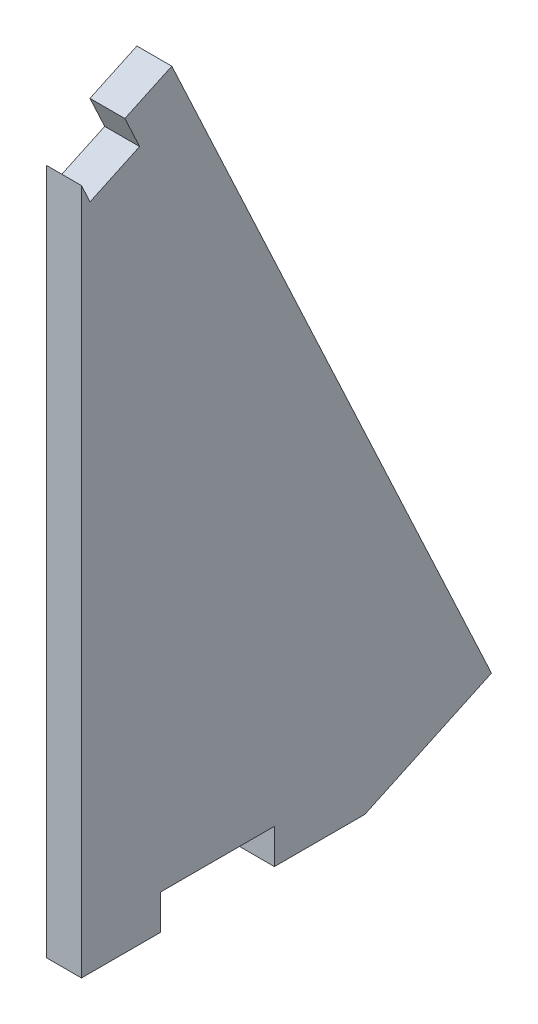
ISO-10303-21;
HEADER;
FILE_DESCRIPTION(('STEP AP214'),'2;1');
FILE_NAME('part.step','',(''),(''),'','','');
FILE_SCHEMA(('AUTOMOTIVE_DESIGN { 1 0 10303 214 1 1 1 1 }'));
ENDSEC;
DATA;
#1=APPLICATION_CONTEXT('core data for automotive mechanical design processes');
#2=APPLICATION_PROTOCOL_DEFINITION('international standard','automotive_design',2000,#1);
#3=PRODUCT_CONTEXT('',#1,'mechanical');
#4=PRODUCT('Part','Part','',(#3));
#5=PRODUCT_RELATED_PRODUCT_CATEGORY('part','',(#4));
#6=PRODUCT_DEFINITION_FORMATION('','',#4);
#7=PRODUCT_DEFINITION_CONTEXT('part definition',#1,'design');
#8=PRODUCT_DEFINITION('design','',#6,#7);
#9=PRODUCT_DEFINITION_SHAPE('','',#8);
#10=(LENGTH_UNIT() NAMED_UNIT(*) SI_UNIT(.MILLI.,.METRE.));
#11=(NAMED_UNIT(*) PLANE_ANGLE_UNIT() SI_UNIT($,.RADIAN.));
#12=(NAMED_UNIT(*) SI_UNIT($,.STERADIAN.) SOLID_ANGLE_UNIT());
#13=UNCERTAINTY_MEASURE_WITH_UNIT(LENGTH_MEASURE(1.E-05),#10,'distance_accuracy_value','');
#14=(GEOMETRIC_REPRESENTATION_CONTEXT(3) GLOBAL_UNCERTAINTY_ASSIGNED_CONTEXT((#13)) GLOBAL_UNIT_ASSIGNED_CONTEXT((#10,
#11,#12)) REPRESENTATION_CONTEXT('',''));
#15=CARTESIAN_POINT('',(0.,0.,0.));
#16=DIRECTION('',(0.,0.,1.));
#17=DIRECTION('',(1.,0.,0.));
#18=AXIS2_PLACEMENT_3D('',#15,#16,#17);
#19=CARTESIAN_POINT('',(-3.,0.,25.357095704442));
#20=DIRECTION('',(0.,-1.,0.));
#21=DIRECTION('',(0.,0.,-1.));
#22=AXIS2_PLACEMENT_3D('',#19,#20,#21);
#23=PLANE('',#22);
#24=DIRECTION('',(1.,0.,0.));
#25=VECTOR('',#24,1.);
#26=CARTESIAN_POINT('',(-8.25652354699636,0.,24.357095704442));
#27=LINE('',#26,#25);
#28=CARTESIAN_POINT('',(-3.,0.,24.357095704442));
#29=VERTEX_POINT('',#28);
#30=CARTESIAN_POINT('',(0.,0.,24.357095704442));
#31=VERTEX_POINT('',#30);
#32=EDGE_CURVE('E207',#29,#31,#27,.T.);
#33=ORIENTED_EDGE('',*,*,#32,.F.);
#34=DIRECTION('',(0.,0.,-1.));
#35=VECTOR('',#34,1.);
#36=CARTESIAN_POINT('',(-3.,0.,25.357095704442));
#37=LINE('',#36,#35);
#38=CARTESIAN_POINT('',(-3.,0.,17.578547852221));
#39=VERTEX_POINT('',#38);
#40=EDGE_CURVE('E83',#29,#39,#37,.T.);
#41=ORIENTED_EDGE('',*,*,#40,.T.);
#42=DIRECTION('',(1.,0.,0.));
#43=VECTOR('',#42,1.);
#44=CARTESIAN_POINT('',(-3.,0.,17.578547852221));
#45=LINE('',#44,#43);
#46=CARTESIAN_POINT('',(0.,0.,17.578547852221));
#47=VERTEX_POINT('',#46);
#48=EDGE_CURVE('E23',#39,#47,#45,.T.);
#49=ORIENTED_EDGE('',*,*,#48,.T.);
#50=DIRECTION('',(0.,0.,-1.));
#51=VECTOR('',#50,1.);
#52=CARTESIAN_POINT('',(0.,0.,25.357095704442));
#53=LINE('',#52,#51);
#54=EDGE_CURVE('E139',#31,#47,#53,.T.);
#55=ORIENTED_EDGE('',*,*,#54,.F.);
#56=EDGE_LOOP('',(#33,#41,#49,#55));
#57=FACE_BOUND('',#56,.T.);
#58=ADVANCED_FACE('F16',(#57),#23,.T.);
#59=CARTESIAN_POINT('',(-3.,0.,17.578547852221));
#60=DIRECTION('',(0.,0.,-1.));
#61=DIRECTION('',(-1.,0.,0.));
#62=AXIS2_PLACEMENT_3D('',#59,#60,#61);
#63=PLANE('',#62);
#64=DIRECTION('',(0.,1.,0.));
#65=VECTOR('',#64,1.);
#66=CARTESIAN_POINT('',(0.,0.,17.578547852221));
#67=LINE('',#66,#65);
#68=CARTESIAN_POINT('',(0.,3.,17.578547852221));
#69=VERTEX_POINT('',#68);
#70=EDGE_CURVE('E142',#47,#69,#67,.T.);
#71=ORIENTED_EDGE('',*,*,#70,.F.);
#72=ORIENTED_EDGE('',*,*,#48,.F.);
#73=DIRECTION('',(0.,1.,0.));
#74=VECTOR('',#73,1.);
#75=CARTESIAN_POINT('',(-3.,0.,17.578547852221));
#76=LINE('',#75,#74);
#77=CARTESIAN_POINT('',(-3.,3.,17.578547852221));
#78=VERTEX_POINT('',#77);
#79=EDGE_CURVE('E215',#39,#78,#76,.T.);
#80=ORIENTED_EDGE('',*,*,#79,.T.);
#81=DIRECTION('',(1.,0.,0.));
#82=VECTOR('',#81,1.);
#83=CARTESIAN_POINT('',(-3.,3.,17.578547852221));
#84=LINE('',#83,#82);
#85=EDGE_CURVE('E190',#78,#69,#84,.T.);
#86=ORIENTED_EDGE('',*,*,#85,.T.);
#87=EDGE_LOOP('',(#71,#72,#80,#86));
#88=FACE_BOUND('',#87,.T.);
#89=ADVANCED_FACE('F197',(#88),#63,.T.);
#90=CARTESIAN_POINT('',(-3.,3.,17.578547852221));
#91=DIRECTION('',(0.,-1.,0.));
#92=DIRECTION('',(0.,0.,-1.));
#93=AXIS2_PLACEMENT_3D('',#90,#91,#92);
#94=PLANE('',#93);
#95=DIRECTION('',(0.,0.,-1.));
#96=VECTOR('',#95,1.);
#97=CARTESIAN_POINT('',(0.,3.,17.578547852221));
#98=LINE('',#97,#96);
#99=CARTESIAN_POINT('',(0.,3.,7.77854785222101));
#100=VERTEX_POINT('',#99);
#101=EDGE_CURVE('E146',#69,#100,#98,.T.);
#102=ORIENTED_EDGE('',*,*,#101,.F.);
#103=ORIENTED_EDGE('',*,*,#85,.F.);
#104=DIRECTION('',(0.,0.,-1.));
#105=VECTOR('',#104,1.);
#106=CARTESIAN_POINT('',(-3.,3.,17.578547852221));
#107=LINE('',#106,#105);
#108=CARTESIAN_POINT('',(-3.,3.,7.77854785222101));
#109=VERTEX_POINT('',#108);
#110=EDGE_CURVE('E217',#78,#109,#107,.T.);
#111=ORIENTED_EDGE('',*,*,#110,.T.);
#112=DIRECTION('',(1.,0.,0.));
#113=VECTOR('',#112,1.);
#114=CARTESIAN_POINT('',(-3.,3.,7.77854785222101));
#115=LINE('',#114,#113);
#116=EDGE_CURVE('E188',#109,#100,#115,.T.);
#117=ORIENTED_EDGE('',*,*,#116,.T.);
#118=EDGE_LOOP('',(#102,#103,#111,#117));
#119=FACE_BOUND('',#118,.T.);
#120=ADVANCED_FACE('F245',(#119),#94,.T.);
#121=CARTESIAN_POINT('',(-3.,3.,7.77854785222101));
#122=DIRECTION('',(0.,0.,1.));
#123=DIRECTION('',(1.,0.,0.));
#124=AXIS2_PLACEMENT_3D('',#121,#122,#123);
#125=PLANE('',#124);
#126=DIRECTION('',(0.,-1.,0.));
#127=VECTOR('',#126,1.);
#128=CARTESIAN_POINT('',(0.,3.,7.77854785222101));
#129=LINE('',#128,#127);
#130=CARTESIAN_POINT('',(0.,0.,7.77854785222101));
#131=VERTEX_POINT('',#130);
#132=EDGE_CURVE('E150',#100,#131,#129,.T.);
#133=ORIENTED_EDGE('',*,*,#132,.F.);
#134=ORIENTED_EDGE('',*,*,#116,.F.);
#135=DIRECTION('',(0.,-1.,0.));
#136=VECTOR('',#135,1.);
#137=CARTESIAN_POINT('',(-3.,3.,7.77854785222101));
#138=LINE('',#137,#136);
#139=CARTESIAN_POINT('',(-3.,0.,7.77854785222101));
#140=VERTEX_POINT('',#139);
#141=EDGE_CURVE('E220',#109,#140,#138,.T.);
#142=ORIENTED_EDGE('',*,*,#141,.T.);
#143=DIRECTION('',(1.,0.,0.));
#144=VECTOR('',#143,1.);
#145=CARTESIAN_POINT('',(-3.,0.,7.77854785222101));
#146=LINE('',#145,#144);
#147=EDGE_CURVE('E186',#140,#131,#146,.T.);
#148=ORIENTED_EDGE('',*,*,#147,.T.);
#149=EDGE_LOOP('',(#133,#134,#142,#148));
#150=FACE_BOUND('',#149,.T.);
#151=ADVANCED_FACE('F242',(#150),#125,.T.);
#152=CARTESIAN_POINT('',(-3.,0.,7.77854785222101));
#153=DIRECTION('',(0.,-1.,0.));
#154=DIRECTION('',(0.,0.,-1.));
#155=AXIS2_PLACEMENT_3D('',#152,#153,#154);
#156=PLANE('',#155);
#157=DIRECTION('',(0.,0.,-1.));
#158=VECTOR('',#157,1.);
#159=CARTESIAN_POINT('',(0.,0.,7.77854785222101));
#160=LINE('',#159,#158);
#161=CARTESIAN_POINT('',(0.,0.,0.));
#162=VERTEX_POINT('',#161);
#163=EDGE_CURVE('E154',#131,#162,#160,.T.);
#164=ORIENTED_EDGE('',*,*,#163,.F.);
#165=ORIENTED_EDGE('',*,*,#147,.F.);
#166=DIRECTION('',(0.,0.,-1.));
#167=VECTOR('',#166,1.);
#168=CARTESIAN_POINT('',(-3.,0.,7.77854785222101));
#169=LINE('',#168,#167);
#170=CARTESIAN_POINT('',(-3.,0.,0.));
#171=VERTEX_POINT('',#170);
#172=EDGE_CURVE('E223',#140,#171,#169,.T.);
#173=ORIENTED_EDGE('',*,*,#172,.T.);
#174=DIRECTION('',(1.,0.,0.));
#175=VECTOR('',#174,1.);
#176=CARTESIAN_POINT('',(-3.,0.,0.));
#177=LINE('',#176,#175);
#178=EDGE_CURVE('E184',#171,#162,#177,.T.);
#179=ORIENTED_EDGE('',*,*,#178,.T.);
#180=EDGE_LOOP('',(#164,#165,#173,#179));
#181=FACE_BOUND('',#180,.T.);
#182=ADVANCED_FACE('F239',(#181),#156,.T.);
#183=CARTESIAN_POINT('',(-3.,0.,0.));
#184=DIRECTION('',(0.,-0.90630778703665,-0.4226182617407));
#185=DIRECTION('',(0.,0.4226182617407,-0.90630778703665));
#186=AXIS2_PLACEMENT_3D('',#183,#184,#185);
#187=PLANE('',#186);
#188=DIRECTION('',(0.,0.4226182617407,-0.90630778703665));
#189=VECTOR('',#188,1.);
#190=CARTESIAN_POINT('',(0.,0.,0.));
#191=LINE('',#190,#189);
#192=CARTESIAN_POINT('',(0.,5.0714191408884,-10.8756934444398));
#193=VERTEX_POINT('',#192);
#194=EDGE_CURVE('E158',#162,#193,#191,.T.);
#195=ORIENTED_EDGE('',*,*,#194,.F.);
#196=ORIENTED_EDGE('',*,*,#178,.F.);
#197=DIRECTION('',(0.,0.4226182617407,-0.90630778703665));
#198=VECTOR('',#197,1.);
#199=CARTESIAN_POINT('',(-3.,0.,0.));
#200=LINE('',#199,#198);
#201=CARTESIAN_POINT('',(-3.,5.0714191408884,-10.8756934444398));
#202=VERTEX_POINT('',#201);
#203=EDGE_CURVE('E226',#171,#202,#200,.T.);
#204=ORIENTED_EDGE('',*,*,#203,.T.);
#205=DIRECTION('',(1.,0.,0.));
#206=VECTOR('',#205,1.);
#207=CARTESIAN_POINT('',(-3.,5.0714191408884,-10.8756934444398));
#208=LINE('',#207,#206);
#209=EDGE_CURVE('E182',#202,#193,#208,.T.);
#210=ORIENTED_EDGE('',*,*,#209,.T.);
#211=EDGE_LOOP('',(#195,#196,#204,#210));
#212=FACE_BOUND('',#211,.T.);
#213=ADVANCED_FACE('F236',(#212),#187,.T.);
#214=CARTESIAN_POINT('',(-3.,5.0714191408884,-10.8756934444398));
#215=DIRECTION('',(0.,0.4226182617407,-0.90630778703665));
#216=DIRECTION('',(0.,0.90630778703665,0.4226182617407));
#217=AXIS2_PLACEMENT_3D('',#214,#215,#216);
#218=PLANE('',#217);
#219=DIRECTION('',(0.,0.90630778703665,0.4226182617407));
#220=VECTOR('',#219,1.);
#221=CARTESIAN_POINT('',(0.,5.0714191408884,-10.8756934444398));
#222=LINE('',#221,#220);
#223=CARTESIAN_POINT('',(0.,63.9814252982707,16.5944935687057));
#224=VERTEX_POINT('',#223);
#225=EDGE_CURVE('E162',#193,#224,#222,.T.);
#226=ORIENTED_EDGE('',*,*,#225,.F.);
#227=ORIENTED_EDGE('',*,*,#209,.F.);
#228=DIRECTION('',(0.,0.90630778703665,0.4226182617407));
#229=VECTOR('',#228,1.);
#230=CARTESIAN_POINT('',(-3.,5.0714191408884,-10.8756934444398));
#231=LINE('',#230,#229);
#232=CARTESIAN_POINT('',(-3.,63.9814252982707,16.5944935687057));
#233=VERTEX_POINT('',#232);
#234=EDGE_CURVE('E128',#202,#233,#231,.T.);
#235=ORIENTED_EDGE('',*,*,#234,.T.);
#236=DIRECTION('',(1.,0.,0.));
#237=VECTOR('',#236,1.);
#238=CARTESIAN_POINT('',(-3.,63.9814252982707,16.5944935687057));
#239=LINE('',#238,#237);
#240=EDGE_CURVE('E119',#233,#224,#239,.T.);
#241=ORIENTED_EDGE('',*,*,#240,.T.);
#242=EDGE_LOOP('',(#226,#227,#235,#241));
#243=FACE_BOUND('',#242,.T.);
#244=ADVANCED_FACE('F230',(#243),#218,.T.);
#245=CARTESIAN_POINT('',(-3.,62.1005464481948,20.6280512793334));
#246=DIRECTION('',(0.,0.90630778703665,0.4226182617407));
#247=DIRECTION('',(0.,-0.4226182617407,0.90630778703665));
#248=AXIS2_PLACEMENT_3D('',#245,#246,#247);
#249=PLANE('',#248);
#250=DIRECTION('',(0.,-0.4226182617407,0.90630778703665));
#251=VECTOR('',#250,1.);
#252=CARTESIAN_POINT('',(0.,62.1005464481948,20.6280512793334));
#253=LINE('',#252,#251);
#254=CARTESIAN_POINT('',(0.,62.1005464481948,20.6280512793334));
#255=VERTEX_POINT('',#254);
#256=EDGE_CURVE('E166',#224,#255,#253,.T.);
#257=ORIENTED_EDGE('',*,*,#256,.F.);
#258=ORIENTED_EDGE('',*,*,#240,.F.);
#259=DIRECTION('',(0.,-0.4226182617407,0.90630778703665));
#260=VECTOR('',#259,1.);
#261=CARTESIAN_POINT('',(-3.,62.1005464481948,20.6280512793334));
#262=LINE('',#261,#260);
#263=CARTESIAN_POINT('',(-3.,62.1005464481948,20.6280512793334));
#264=VERTEX_POINT('',#263);
#265=EDGE_CURVE('E123',#233,#264,#262,.T.);
#266=ORIENTED_EDGE('',*,*,#265,.T.);
#267=DIRECTION('',(1.,0.,0.));
#268=VECTOR('',#267,1.);
#269=CARTESIAN_POINT('',(-3.,62.1005464481948,20.6280512793334));
#270=LINE('',#269,#268);
#271=EDGE_CURVE('E108',#264,#255,#270,.T.);
#272=ORIENTED_EDGE('',*,*,#271,.T.);
#273=EDGE_LOOP('',(#257,#258,#266,#272));
#274=FACE_BOUND('',#273,.T.);
#275=ADVANCED_FACE('F124',(#274),#249,.T.);
#276=CARTESIAN_POINT('',(-3.,59.3816230870849,19.3601964941113));
#277=DIRECTION('',(0.,-0.4226182617407,0.90630778703665));
#278=DIRECTION('',(0.,-0.90630778703665,-0.4226182617407));
#279=AXIS2_PLACEMENT_3D('',#276,#277,#278);
#280=PLANE('',#279);
#281=DIRECTION('',(0.,-0.90630778703665,-0.4226182617407));
#282=VECTOR('',#281,1.);
#283=CARTESIAN_POINT('',(0.,59.3816230870849,19.3601964941113));
#284=LINE('',#283,#282);
#285=CARTESIAN_POINT('',(0.,59.3816230870849,19.3601964941113));
#286=VERTEX_POINT('',#285);
#287=EDGE_CURVE('E115',#255,#286,#284,.T.);
#288=ORIENTED_EDGE('',*,*,#287,.F.);
#289=ORIENTED_EDGE('',*,*,#271,.F.);
#290=DIRECTION('',(0.,-0.90630778703665,-0.4226182617407));
#291=VECTOR('',#290,1.);
#292=CARTESIAN_POINT('',(-3.,59.3816230870849,19.3601964941113));
#293=LINE('',#292,#291);
#294=CARTESIAN_POINT('',(-3.,59.3816230870849,19.3601964941113));
#295=VERTEX_POINT('',#294);
#296=EDGE_CURVE('E112',#264,#295,#293,.T.);
#297=ORIENTED_EDGE('',*,*,#296,.T.);
#298=DIRECTION('',(1.,0.,0.));
#299=VECTOR('',#298,1.);
#300=CARTESIAN_POINT('',(-3.,59.3816230870849,19.3601964941113));
#301=LINE('',#300,#299);
#302=EDGE_CURVE('E120',#295,#286,#301,.T.);
#303=ORIENTED_EDGE('',*,*,#302,.T.);
#304=EDGE_LOOP('',(#288,#289,#297,#303));
#305=FACE_BOUND('',#304,.T.);
#306=ADVANCED_FACE('F110',(#305),#280,.T.);
#307=CARTESIAN_POINT('',(-3.,57.3953172569036,23.6198430931835));
#308=DIRECTION('',(0.,0.906307787036649,0.4226182617407));
#309=DIRECTION('',(0.,-0.422618261740701,0.90630778703665));
#310=AXIS2_PLACEMENT_3D('',#307,#308,#309);
#311=PLANE('',#310);
#312=DIRECTION('',(0.,-0.422618261740701,0.906307787036649));
#313=VECTOR('',#312,1.);
#314=CARTESIAN_POINT('',(0.,57.3953172569036,23.6198430931835));
#315=LINE('',#314,#313);
#316=CARTESIAN_POINT('',(0.,57.3953172569036,23.6198430931835));
#317=VERTEX_POINT('',#316);
#318=EDGE_CURVE('E171',#286,#317,#315,.T.);
#319=ORIENTED_EDGE('',*,*,#318,.F.);
#320=ORIENTED_EDGE('',*,*,#302,.F.);
#321=DIRECTION('',(0.,-0.422618261740701,0.906307787036649));
#322=VECTOR('',#321,1.);
#323=CARTESIAN_POINT('',(-3.,57.3953172569036,23.6198430931835));
#324=LINE('',#323,#322);
#325=CARTESIAN_POINT('',(-3.,57.3953172569036,23.6198430931835));
#326=VERTEX_POINT('',#325);
#327=EDGE_CURVE('E132',#295,#326,#324,.T.);
#328=ORIENTED_EDGE('',*,*,#327,.T.);
#329=DIRECTION('',(1.,0.,0.));
#330=VECTOR('',#329,1.);
#331=CARTESIAN_POINT('',(-3.,57.3953172569036,23.6198430931835));
#332=LINE('',#331,#330);
#333=EDGE_CURVE('E39',#326,#317,#332,.T.);
#334=ORIENTED_EDGE('',*,*,#333,.T.);
#335=EDGE_LOOP('',(#319,#320,#328,#334));
#336=FACE_BOUND('',#335,.T.);
#337=ADVANCED_FACE('F246',(#336),#311,.T.);
#338=CARTESIAN_POINT('',(-3.,60.1142406180135,24.8876978784056));
#339=DIRECTION('',(0.,0.422618261740701,-0.906307787036649));
#340=DIRECTION('',(0.,0.906307787036649,0.422618261740701));
#341=AXIS2_PLACEMENT_3D('',#338,#339,#340);
#342=PLANE('',#341);
#343=DIRECTION('',(-1.,0.,0.));
#344=VECTOR('',#343,1.);
#345=CARTESIAN_POINT('',(-3.,58.976360583911,24.357095704442));
#346=LINE('',#345,#344);
#347=CARTESIAN_POINT('',(0.,58.976360583911,24.357095704442));
#348=VERTEX_POINT('',#347);
#349=CARTESIAN_POINT('',(-3.,58.976360583911,24.357095704442));
#350=VERTEX_POINT('',#349);
#351=EDGE_CURVE('E206',#348,#350,#346,.T.);
#352=ORIENTED_EDGE('',*,*,#351,.F.);
#353=DIRECTION('',(0.,0.906307787036649,0.422618261740701));
#354=VECTOR('',#353,1.);
#355=CARTESIAN_POINT('',(0.,60.1142406180135,24.8876978784056));
#356=LINE('',#355,#354);
#357=EDGE_CURVE('E175',#317,#348,#356,.T.);
#358=ORIENTED_EDGE('',*,*,#357,.F.);
#359=ORIENTED_EDGE('',*,*,#333,.F.);
#360=DIRECTION('',(0.,0.906307787036649,0.422618261740701));
#361=VECTOR('',#360,1.);
#362=CARTESIAN_POINT('',(-3.,60.1142406180135,24.8876978784056));
#363=LINE('',#362,#361);
#364=EDGE_CURVE('E134',#326,#350,#363,.T.);
#365=ORIENTED_EDGE('',*,*,#364,.T.);
#366=EDGE_LOOP('',(#352,#358,#359,#365));
#367=FACE_BOUND('',#366,.T.);
#368=ADVANCED_FACE('F208',(#367),#342,.T.);
#369=CARTESIAN_POINT('',(-3.,0.,0.));
#370=DIRECTION('',(-1.,0.,0.));
#371=DIRECTION('',(0.,-1.,0.));
#372=AXIS2_PLACEMENT_3D('',#369,#370,#371);
#373=PLANE('',#372);
#374=DIRECTION('',(0.,-1.,0.));
#375=VECTOR('',#374,1.);
#376=CARTESIAN_POINT('',(-3.,0.,24.357095704442));
#377=LINE('',#376,#375);
#378=EDGE_CURVE('E30',#350,#29,#377,.T.);
#379=ORIENTED_EDGE('',*,*,#378,.F.);
#380=ORIENTED_EDGE('',*,*,#364,.F.);
#381=ORIENTED_EDGE('',*,*,#327,.F.);
#382=ORIENTED_EDGE('',*,*,#296,.F.);
#383=ORIENTED_EDGE('',*,*,#265,.F.);
#384=ORIENTED_EDGE('',*,*,#234,.F.);
#385=ORIENTED_EDGE('',*,*,#203,.F.);
#386=ORIENTED_EDGE('',*,*,#172,.F.);
#387=ORIENTED_EDGE('',*,*,#141,.F.);
#388=ORIENTED_EDGE('',*,*,#110,.F.);
#389=ORIENTED_EDGE('',*,*,#79,.F.);
#390=ORIENTED_EDGE('',*,*,#40,.F.);
#391=EDGE_LOOP('',(#379,#380,#381,#382,#383,#384,#385,#386,#387,#388,#389,#390));
#392=FACE_BOUND('',#391,.T.);
#393=ADVANCED_FACE('F130',(#392),#373,.T.);
#394=CARTESIAN_POINT('',(0.,0.,0.));
#395=DIRECTION('',(-1.,0.,0.));
#396=DIRECTION('',(0.,-1.,0.));
#397=AXIS2_PLACEMENT_3D('',#394,#395,#396);
#398=PLANE('',#397);
#399=ORIENTED_EDGE('',*,*,#357,.T.);
#400=DIRECTION('',(0.,-1.,0.));
#401=VECTOR('',#400,1.);
#402=CARTESIAN_POINT('',(0.,0.,24.357095704442));
#403=LINE('',#402,#401);
#404=EDGE_CURVE('E10',#348,#31,#403,.T.);
#405=ORIENTED_EDGE('',*,*,#404,.T.);
#406=ORIENTED_EDGE('',*,*,#54,.T.);
#407=ORIENTED_EDGE('',*,*,#70,.T.);
#408=ORIENTED_EDGE('',*,*,#101,.T.);
#409=ORIENTED_EDGE('',*,*,#132,.T.);
#410=ORIENTED_EDGE('',*,*,#163,.T.);
#411=ORIENTED_EDGE('',*,*,#194,.T.);
#412=ORIENTED_EDGE('',*,*,#225,.T.);
#413=ORIENTED_EDGE('',*,*,#256,.T.);
#414=ORIENTED_EDGE('',*,*,#287,.T.);
#415=ORIENTED_EDGE('',*,*,#318,.T.);
#416=EDGE_LOOP('',(#399,#405,#406,#407,#408,#409,#410,#411,#412,#413,#414,#415));
#417=FACE_BOUND('',#416,.T.);
#418=ADVANCED_FACE('F200',(#417),#398,.F.);
#419=CARTESIAN_POINT('',(-8.25652354699636,75.0725917015422,24.357095704442));
#420=DIRECTION('',(0.,0.,-1.));
#421=DIRECTION('',(-1.,0.,0.));
#422=AXIS2_PLACEMENT_3D('',#419,#420,#421);
#423=PLANE('',#422);
#424=ORIENTED_EDGE('',*,*,#378,.T.);
#425=ORIENTED_EDGE('',*,*,#32,.T.);
#426=ORIENTED_EDGE('',*,*,#404,.F.);
#427=ORIENTED_EDGE('',*,*,#351,.T.);
#428=EDGE_LOOP('',(#424,#425,#426,#427));
#429=FACE_BOUND('',#428,.T.);
#430=ADVANCED_FACE('F205',(#429),#423,.F.);
#431=CLOSED_SHELL('',(#58,#89,#120,#151,#182,#213,#244,#275,#306,#337,#368,#393,#418,#430));
#432=MANIFOLD_SOLID_BREP('B1',#431);
#433=ADVANCED_BREP_SHAPE_REPRESENTATION('',(#18,#432),#14);
#434=SHAPE_DEFINITION_REPRESENTATION(#9,#433);
ENDSEC;
END-ISO-10303-21;
